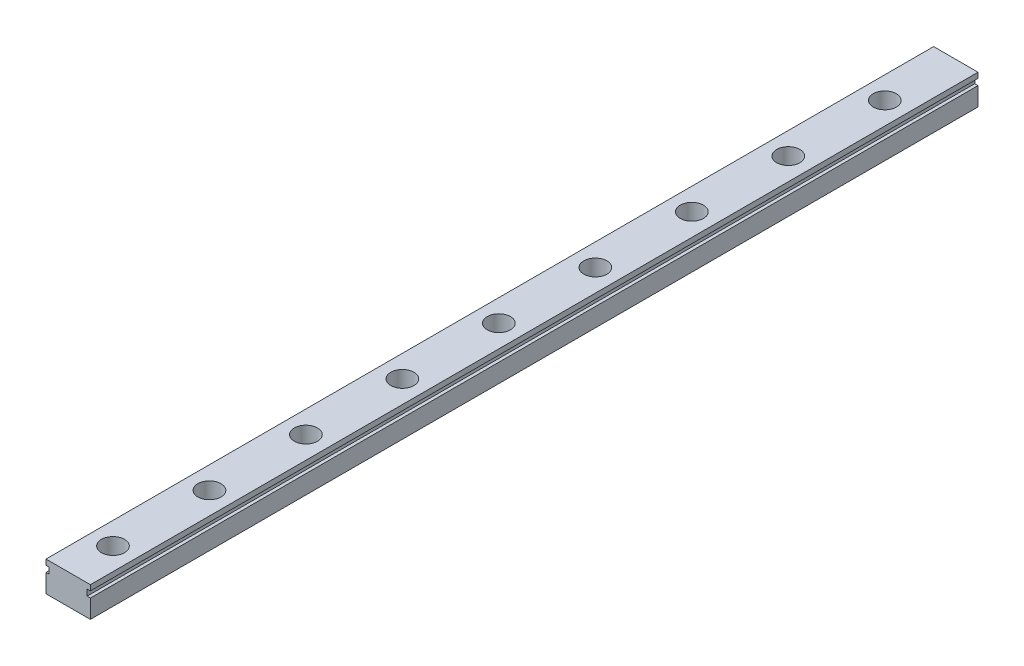
ISO-10303-21;
HEADER;
FILE_DESCRIPTION(('STEP AP214'),'2;1');
FILE_NAME('part.step','',(''),(''),'','','');
FILE_SCHEMA(('AUTOMOTIVE_DESIGN { 1 0 10303 214 1 1 1 1 }'));
ENDSEC;
DATA;
#1=APPLICATION_CONTEXT('core data for automotive mechanical design processes');
#2=APPLICATION_PROTOCOL_DEFINITION('international standard','automotive_design',2000,#1);
#3=PRODUCT_CONTEXT('',#1,'mechanical');
#4=PRODUCT('Part','Part','',(#3));
#5=PRODUCT_RELATED_PRODUCT_CATEGORY('part','',(#4));
#6=PRODUCT_DEFINITION_FORMATION('','',#4);
#7=PRODUCT_DEFINITION_CONTEXT('part definition',#1,'design');
#8=PRODUCT_DEFINITION('design','',#6,#7);
#9=PRODUCT_DEFINITION_SHAPE('','',#8);
#10=(LENGTH_UNIT() NAMED_UNIT(*) SI_UNIT(.MILLI.,.METRE.));
#11=(NAMED_UNIT(*) PLANE_ANGLE_UNIT() SI_UNIT($,.RADIAN.));
#12=(NAMED_UNIT(*) SI_UNIT($,.STERADIAN.) SOLID_ANGLE_UNIT());
#13=UNCERTAINTY_MEASURE_WITH_UNIT(LENGTH_MEASURE(1.E-05),#10,'distance_accuracy_value','');
#14=(GEOMETRIC_REPRESENTATION_CONTEXT(3) GLOBAL_UNCERTAINTY_ASSIGNED_CONTEXT((#13)) GLOBAL_UNIT_ASSIGNED_CONTEXT((#10,
#11,#12)) REPRESENTATION_CONTEXT('',''));
#15=CARTESIAN_POINT('',(0.,0.,0.));
#16=DIRECTION('',(0.,0.,1.));
#17=DIRECTION('',(1.,0.,0.));
#18=AXIS2_PLACEMENT_3D('',#15,#16,#17);
#19=CARTESIAN_POINT('',(5.75,-3.9,230.));
#20=DIRECTION('',(-1.,0.,0.));
#21=DIRECTION('',(0.,0.,1.));
#22=AXIS2_PLACEMENT_3D('',#19,#20,#21);
#23=PLANE('',#22);
#24=DIRECTION('',(0.,1.,0.));
#25=VECTOR('',#24,1.);
#26=CARTESIAN_POINT('',(5.75,-3.9,0.));
#27=LINE('',#26,#25);
#28=CARTESIAN_POINT('',(5.75,-3.9,0.));
#29=VERTEX_POINT('',#28);
#30=CARTESIAN_POINT('',(5.75,0.900000000000001,0.));
#31=VERTEX_POINT('',#30);
#32=EDGE_CURVE('E158',#29,#31,#27,.T.);
#33=ORIENTED_EDGE('',*,*,#32,.T.);
#34=DIRECTION('',(0.,0.,1.));
#35=VECTOR('',#34,1.);
#36=CARTESIAN_POINT('',(5.75,0.900000000000001,0.));
#37=LINE('',#36,#35);
#38=CARTESIAN_POINT('',(5.75,0.900000000000001,230.));
#39=VERTEX_POINT('',#38);
#40=EDGE_CURVE('E159',#31,#39,#37,.T.);
#41=ORIENTED_EDGE('',*,*,#40,.T.);
#42=DIRECTION('',(0.,1.,0.));
#43=VECTOR('',#42,1.);
#44=CARTESIAN_POINT('',(5.75,-3.9,230.));
#45=LINE('',#44,#43);
#46=CARTESIAN_POINT('',(5.75,-3.9,230.));
#47=VERTEX_POINT('',#46);
#48=EDGE_CURVE('E220',#47,#39,#45,.T.);
#49=ORIENTED_EDGE('',*,*,#48,.F.);
#50=DIRECTION('',(0.,0.,-1.));
#51=VECTOR('',#50,1.);
#52=CARTESIAN_POINT('',(5.75,-3.9,230.));
#53=LINE('',#52,#51);
#54=EDGE_CURVE('E181',#47,#29,#53,.T.);
#55=ORIENTED_EDGE('',*,*,#54,.T.);
#56=EDGE_LOOP('',(#33,#41,#49,#55));
#57=FACE_BOUND('',#56,.T.);
#58=ADVANCED_FACE('F43',(#57),#23,.F.);
#59=CARTESIAN_POINT('',(-5.75,-3.9,230.));
#60=DIRECTION('',(1.,0.,0.));
#61=DIRECTION('',(0.,0.,-1.));
#62=AXIS2_PLACEMENT_3D('',#59,#60,#61);
#63=PLANE('',#62);
#64=DIRECTION('',(0.,-1.,0.));
#65=VECTOR('',#64,1.);
#66=CARTESIAN_POINT('',(-5.75,-3.9,0.));
#67=LINE('',#66,#65);
#68=CARTESIAN_POINT('',(-5.75,3.9,0.));
#69=VERTEX_POINT('',#68);
#70=CARTESIAN_POINT('',(-5.75,2.5,0.));
#71=VERTEX_POINT('',#70);
#72=EDGE_CURVE('E174',#69,#71,#67,.T.);
#73=ORIENTED_EDGE('',*,*,#72,.T.);
#74=DIRECTION('',(0.,0.,1.));
#75=VECTOR('',#74,1.);
#76=CARTESIAN_POINT('',(-5.75,2.5,0.));
#77=LINE('',#76,#75);
#78=CARTESIAN_POINT('',(-5.75,2.5,230.));
#79=VERTEX_POINT('',#78);
#80=EDGE_CURVE('E271',#71,#79,#77,.T.);
#81=ORIENTED_EDGE('',*,*,#80,.T.);
#82=DIRECTION('',(0.,-1.,0.));
#83=VECTOR('',#82,1.);
#84=CARTESIAN_POINT('',(-5.75,-3.9,230.));
#85=LINE('',#84,#83);
#86=CARTESIAN_POINT('',(-5.75,3.9,230.));
#87=VERTEX_POINT('',#86);
#88=EDGE_CURVE('E196',#87,#79,#85,.T.);
#89=ORIENTED_EDGE('',*,*,#88,.F.);
#90=DIRECTION('',(0.,0.,-1.));
#91=VECTOR('',#90,1.);
#92=CARTESIAN_POINT('',(-5.75,3.9,230.));
#93=LINE('',#92,#91);
#94=EDGE_CURVE('E52',#87,#69,#93,.T.);
#95=ORIENTED_EDGE('',*,*,#94,.T.);
#96=EDGE_LOOP('',(#73,#81,#89,#95));
#97=FACE_BOUND('',#96,.T.);
#98=ADVANCED_FACE('F193',(#97),#63,.F.);
#99=CARTESIAN_POINT('',(5.75,2.5,230.));
#100=VERTEX_POINT('',#99);
#101=CARTESIAN_POINT('',(5.75,3.9,230.));
#102=VERTEX_POINT('',#101);
#103=EDGE_CURVE('E149',#100,#102,#45,.T.);
#104=ORIENTED_EDGE('',*,*,#103,.F.);
#105=DIRECTION('',(0.,0.,1.));
#106=VECTOR('',#105,1.);
#107=CARTESIAN_POINT('',(5.75,2.5,0.));
#108=LINE('',#107,#106);
#109=CARTESIAN_POINT('',(5.75,2.5,0.));
#110=VERTEX_POINT('',#109);
#111=EDGE_CURVE('E136',#110,#100,#108,.T.);
#112=ORIENTED_EDGE('',*,*,#111,.F.);
#113=CARTESIAN_POINT('',(5.75,3.9,0.));
#114=VERTEX_POINT('',#113);
#115=EDGE_CURVE('E147',#110,#114,#27,.T.);
#116=ORIENTED_EDGE('',*,*,#115,.T.);
#117=DIRECTION('',(0.,0.,-1.));
#118=VECTOR('',#117,1.);
#119=CARTESIAN_POINT('',(5.75,3.9,230.));
#120=LINE('',#119,#118);
#121=EDGE_CURVE('E11',#102,#114,#120,.T.);
#122=ORIENTED_EDGE('',*,*,#121,.F.);
#123=EDGE_LOOP('',(#104,#112,#116,#122));
#124=FACE_BOUND('',#123,.T.);
#125=ADVANCED_FACE('F45',(#124),#23,.F.);
#126=CARTESIAN_POINT('',(-5.75,3.9,230.));
#127=DIRECTION('',(0.,-1.,0.));
#128=DIRECTION('',(0.,0.,-1.));
#129=AXIS2_PLACEMENT_3D('',#126,#127,#128);
#130=PLANE('',#129);
#131=CARTESIAN_POINT('',(0.,3.9,218.4));
#132=DIRECTION('',(0.,1.,0.));
#133=DIRECTION('',(0.,0.,1.));
#134=AXIS2_PLACEMENT_3D('',#131,#132,#133);
#135=CIRCLE('',#134,3.);
#136=CARTESIAN_POINT('',(0.,3.9,221.4));
#137=VERTEX_POINT('',#136);
#138=EDGE_CURVE('E352',#137,#137,#135,.T.);
#139=ORIENTED_EDGE('',*,*,#138,.F.);
#140=EDGE_LOOP('',(#139));
#141=FACE_BOUND('',#140,.T.);
#142=CARTESIAN_POINT('',(0.,3.9,193.4));
#143=DIRECTION('',(0.,1.,0.));
#144=DIRECTION('',(0.,0.,1.));
#145=AXIS2_PLACEMENT_3D('',#142,#143,#144);
#146=CIRCLE('',#145,3.);
#147=CARTESIAN_POINT('',(0.,3.9,196.4));
#148=VERTEX_POINT('',#147);
#149=EDGE_CURVE('E348',#148,#148,#146,.T.);
#150=ORIENTED_EDGE('',*,*,#149,.F.);
#151=EDGE_LOOP('',(#150));
#152=FACE_BOUND('',#151,.T.);
#153=CARTESIAN_POINT('',(0.,3.9,168.4));
#154=DIRECTION('',(0.,1.,0.));
#155=DIRECTION('',(0.,0.,1.));
#156=AXIS2_PLACEMENT_3D('',#153,#154,#155);
#157=CIRCLE('',#156,3.);
#158=CARTESIAN_POINT('',(0.,3.9,171.4));
#159=VERTEX_POINT('',#158);
#160=EDGE_CURVE('E340',#159,#159,#157,.T.);
#161=ORIENTED_EDGE('',*,*,#160,.F.);
#162=EDGE_LOOP('',(#161));
#163=FACE_BOUND('',#162,.T.);
#164=CARTESIAN_POINT('',(0.,3.9,143.4));
#165=DIRECTION('',(0.,1.,0.));
#166=DIRECTION('',(0.,0.,1.));
#167=AXIS2_PLACEMENT_3D('',#164,#165,#166);
#168=CIRCLE('',#167,3.);
#169=CARTESIAN_POINT('',(0.,3.9,146.4));
#170=VERTEX_POINT('',#169);
#171=EDGE_CURVE('E332',#170,#170,#168,.T.);
#172=ORIENTED_EDGE('',*,*,#171,.F.);
#173=EDGE_LOOP('',(#172));
#174=FACE_BOUND('',#173,.T.);
#175=CARTESIAN_POINT('',(0.,3.9,118.4));
#176=DIRECTION('',(0.,1.,0.));
#177=DIRECTION('',(0.,0.,1.));
#178=AXIS2_PLACEMENT_3D('',#175,#176,#177);
#179=CIRCLE('',#178,3.);
#180=CARTESIAN_POINT('',(0.,3.9,121.4));
#181=VERTEX_POINT('',#180);
#182=EDGE_CURVE('E324',#181,#181,#179,.T.);
#183=ORIENTED_EDGE('',*,*,#182,.F.);
#184=EDGE_LOOP('',(#183));
#185=FACE_BOUND('',#184,.T.);
#186=CARTESIAN_POINT('',(0.,3.9,93.4000000000002));
#187=DIRECTION('',(0.,1.,0.));
#188=DIRECTION('',(0.,0.,1.));
#189=AXIS2_PLACEMENT_3D('',#186,#187,#188);
#190=CIRCLE('',#189,3.);
#191=CARTESIAN_POINT('',(0.,3.9,96.4000000000002));
#192=VERTEX_POINT('',#191);
#193=EDGE_CURVE('E316',#192,#192,#190,.T.);
#194=ORIENTED_EDGE('',*,*,#193,.F.);
#195=EDGE_LOOP('',(#194));
#196=FACE_BOUND('',#195,.T.);
#197=CARTESIAN_POINT('',(0.,3.9,68.4000000000002));
#198=DIRECTION('',(0.,1.,0.));
#199=DIRECTION('',(0.,0.,1.));
#200=AXIS2_PLACEMENT_3D('',#197,#198,#199);
#201=CIRCLE('',#200,3.);
#202=CARTESIAN_POINT('',(0.,3.9,71.4000000000002));
#203=VERTEX_POINT('',#202);
#204=EDGE_CURVE('E308',#203,#203,#201,.T.);
#205=ORIENTED_EDGE('',*,*,#204,.F.);
#206=EDGE_LOOP('',(#205));
#207=FACE_BOUND('',#206,.T.);
#208=CARTESIAN_POINT('',(0.,3.9,43.4000000000003));
#209=DIRECTION('',(0.,1.,0.));
#210=DIRECTION('',(0.,0.,1.));
#211=AXIS2_PLACEMENT_3D('',#208,#209,#210);
#212=CIRCLE('',#211,3.);
#213=CARTESIAN_POINT('',(0.,3.9,46.4000000000003));
#214=VERTEX_POINT('',#213);
#215=EDGE_CURVE('E300',#214,#214,#212,.T.);
#216=ORIENTED_EDGE('',*,*,#215,.F.);
#217=EDGE_LOOP('',(#216));
#218=FACE_BOUND('',#217,.T.);
#219=CARTESIAN_POINT('',(0.,3.9,18.4000000000003));
#220=DIRECTION('',(0.,1.,0.));
#221=DIRECTION('',(0.,0.,1.));
#222=AXIS2_PLACEMENT_3D('',#219,#220,#221);
#223=CIRCLE('',#222,3.);
#224=CARTESIAN_POINT('',(0.,3.9,21.4000000000003));
#225=VERTEX_POINT('',#224);
#226=EDGE_CURVE('E291',#225,#225,#223,.T.);
#227=ORIENTED_EDGE('',*,*,#226,.F.);
#228=EDGE_LOOP('',(#227));
#229=FACE_BOUND('',#228,.T.);
#230=DIRECTION('',(-1.,0.,0.));
#231=VECTOR('',#230,1.);
#232=CARTESIAN_POINT('',(-5.75,3.9,0.));
#233=LINE('',#232,#231);
#234=EDGE_CURVE('E156',#114,#69,#233,.T.);
#235=ORIENTED_EDGE('',*,*,#234,.T.);
#236=ORIENTED_EDGE('',*,*,#94,.F.);
#237=DIRECTION('',(-1.,0.,0.));
#238=VECTOR('',#237,1.);
#239=CARTESIAN_POINT('',(-5.75,3.9,230.));
#240=LINE('',#239,#238);
#241=EDGE_CURVE('E224',#102,#87,#240,.T.);
#242=ORIENTED_EDGE('',*,*,#241,.F.);
#243=ORIENTED_EDGE('',*,*,#121,.T.);
#244=EDGE_LOOP('',(#235,#236,#242,#243));
#245=FACE_BOUND('',#244,.T.);
#246=ADVANCED_FACE('F454',(#141,#152,#163,#174,#185,#196,#207,#218,#229,#245),#130,.F.);
#247=CARTESIAN_POINT('',(-5.75,0.900000000000001,230.));
#248=VERTEX_POINT('',#247);
#249=CARTESIAN_POINT('',(-5.75,-3.9,230.));
#250=VERTEX_POINT('',#249);
#251=EDGE_CURVE('E226',#248,#250,#85,.T.);
#252=ORIENTED_EDGE('',*,*,#251,.F.);
#253=DIRECTION('',(0.,0.,1.));
#254=VECTOR('',#253,1.);
#255=CARTESIAN_POINT('',(-5.75,0.900000000000001,0.));
#256=LINE('',#255,#254);
#257=CARTESIAN_POINT('',(-5.75,0.900000000000001,0.));
#258=VERTEX_POINT('',#257);
#259=EDGE_CURVE('E205',#258,#248,#256,.T.);
#260=ORIENTED_EDGE('',*,*,#259,.F.);
#261=CARTESIAN_POINT('',(-5.75,-3.9,0.));
#262=VERTEX_POINT('',#261);
#263=EDGE_CURVE('E173',#258,#262,#67,.T.);
#264=ORIENTED_EDGE('',*,*,#263,.T.);
#265=DIRECTION('',(0.,0.,-1.));
#266=VECTOR('',#265,1.);
#267=CARTESIAN_POINT('',(-5.75,-3.9,230.));
#268=LINE('',#267,#266);
#269=EDGE_CURVE('E185',#250,#262,#268,.T.);
#270=ORIENTED_EDGE('',*,*,#269,.F.);
#271=EDGE_LOOP('',(#252,#260,#264,#270));
#272=FACE_BOUND('',#271,.T.);
#273=ADVANCED_FACE('F242',(#272),#63,.F.);
#274=CARTESIAN_POINT('',(-5.75,-3.9,230.));
#275=DIRECTION('',(0.,1.,0.));
#276=DIRECTION('',(0.,0.,1.));
#277=AXIS2_PLACEMENT_3D('',#274,#275,#276);
#278=PLANE('',#277);
#279=CARTESIAN_POINT('',(0.,-3.9,218.4));
#280=DIRECTION('',(0.,1.,0.));
#281=DIRECTION('',(0.,0.,1.));
#282=AXIS2_PLACEMENT_3D('',#279,#280,#281);
#283=CIRCLE('',#282,1.7);
#284=CARTESIAN_POINT('',(0.,-3.9,220.1));
#285=VERTEX_POINT('',#284);
#286=EDGE_CURVE('E292',#285,#285,#283,.T.);
#287=ORIENTED_EDGE('',*,*,#286,.T.);
#288=EDGE_LOOP('',(#287));
#289=FACE_BOUND('',#288,.T.);
#290=CARTESIAN_POINT('',(0.,-3.9,193.4));
#291=DIRECTION('',(0.,1.,0.));
#292=DIRECTION('',(0.,0.,1.));
#293=AXIS2_PLACEMENT_3D('',#290,#291,#292);
#294=CIRCLE('',#293,1.7);
#295=CARTESIAN_POINT('',(0.,-3.9,195.1));
#296=VERTEX_POINT('',#295);
#297=EDGE_CURVE('E415',#296,#296,#294,.T.);
#298=ORIENTED_EDGE('',*,*,#297,.T.);
#299=EDGE_LOOP('',(#298));
#300=FACE_BOUND('',#299,.T.);
#301=CARTESIAN_POINT('',(0.,-3.9,168.4));
#302=DIRECTION('',(0.,1.,0.));
#303=DIRECTION('',(0.,0.,1.));
#304=AXIS2_PLACEMENT_3D('',#301,#302,#303);
#305=CIRCLE('',#304,1.7);
#306=CARTESIAN_POINT('',(0.,-3.9,170.1));
#307=VERTEX_POINT('',#306);
#308=EDGE_CURVE('E407',#307,#307,#305,.T.);
#309=ORIENTED_EDGE('',*,*,#308,.T.);
#310=EDGE_LOOP('',(#309));
#311=FACE_BOUND('',#310,.T.);
#312=CARTESIAN_POINT('',(0.,-3.9,143.4));
#313=DIRECTION('',(0.,1.,0.));
#314=DIRECTION('',(0.,0.,1.));
#315=AXIS2_PLACEMENT_3D('',#312,#313,#314);
#316=CIRCLE('',#315,1.7);
#317=CARTESIAN_POINT('',(0.,-3.9,145.1));
#318=VERTEX_POINT('',#317);
#319=EDGE_CURVE('E399',#318,#318,#316,.T.);
#320=ORIENTED_EDGE('',*,*,#319,.T.);
#321=EDGE_LOOP('',(#320));
#322=FACE_BOUND('',#321,.T.);
#323=CARTESIAN_POINT('',(0.,-3.9,118.4));
#324=DIRECTION('',(0.,1.,0.));
#325=DIRECTION('',(0.,0.,1.));
#326=AXIS2_PLACEMENT_3D('',#323,#324,#325);
#327=CIRCLE('',#326,1.70000000000001);
#328=CARTESIAN_POINT('',(0.,-3.9,120.1));
#329=VERTEX_POINT('',#328);
#330=EDGE_CURVE('E391',#329,#329,#327,.T.);
#331=ORIENTED_EDGE('',*,*,#330,.T.);
#332=EDGE_LOOP('',(#331));
#333=FACE_BOUND('',#332,.T.);
#334=CARTESIAN_POINT('',(0.,-3.9,93.4000000000002));
#335=DIRECTION('',(0.,1.,0.));
#336=DIRECTION('',(0.,0.,1.));
#337=AXIS2_PLACEMENT_3D('',#334,#335,#336);
#338=CIRCLE('',#337,1.70000000000001);
#339=CARTESIAN_POINT('',(0.,-3.9,95.1000000000002));
#340=VERTEX_POINT('',#339);
#341=EDGE_CURVE('E383',#340,#340,#338,.T.);
#342=ORIENTED_EDGE('',*,*,#341,.T.);
#343=EDGE_LOOP('',(#342));
#344=FACE_BOUND('',#343,.T.);
#345=CARTESIAN_POINT('',(0.,-3.9,68.4000000000002));
#346=DIRECTION('',(0.,1.,0.));
#347=DIRECTION('',(0.,0.,1.));
#348=AXIS2_PLACEMENT_3D('',#345,#346,#347);
#349=CIRCLE('',#348,1.70000000000001);
#350=CARTESIAN_POINT('',(0.,-3.9,70.1000000000003));
#351=VERTEX_POINT('',#350);
#352=EDGE_CURVE('E375',#351,#351,#349,.T.);
#353=ORIENTED_EDGE('',*,*,#352,.T.);
#354=EDGE_LOOP('',(#353));
#355=FACE_BOUND('',#354,.T.);
#356=CARTESIAN_POINT('',(0.,-3.9,43.4000000000003));
#357=DIRECTION('',(0.,1.,0.));
#358=DIRECTION('',(0.,0.,1.));
#359=AXIS2_PLACEMENT_3D('',#356,#357,#358);
#360=CIRCLE('',#359,1.70000000000001);
#361=CARTESIAN_POINT('',(0.,-3.9,45.1000000000003));
#362=VERTEX_POINT('',#361);
#363=EDGE_CURVE('E367',#362,#362,#360,.T.);
#364=ORIENTED_EDGE('',*,*,#363,.T.);
#365=EDGE_LOOP('',(#364));
#366=FACE_BOUND('',#365,.T.);
#367=CARTESIAN_POINT('',(0.,-3.9,18.4000000000003));
#368=DIRECTION('',(0.,1.,0.));
#369=DIRECTION('',(0.,0.,1.));
#370=AXIS2_PLACEMENT_3D('',#367,#368,#369);
#371=CIRCLE('',#370,1.70000000000001);
#372=CARTESIAN_POINT('',(0.,-3.9,20.1000000000003));
#373=VERTEX_POINT('',#372);
#374=EDGE_CURVE('E359',#373,#373,#371,.T.);
#375=ORIENTED_EDGE('',*,*,#374,.T.);
#376=EDGE_LOOP('',(#375));
#377=FACE_BOUND('',#376,.T.);
#378=DIRECTION('',(1.,0.,0.));
#379=VECTOR('',#378,1.);
#380=CARTESIAN_POINT('',(-5.75,-3.9,0.));
#381=LINE('',#380,#379);
#382=EDGE_CURVE('E178',#262,#29,#381,.T.);
#383=ORIENTED_EDGE('',*,*,#382,.T.);
#384=ORIENTED_EDGE('',*,*,#54,.F.);
#385=DIRECTION('',(1.,0.,0.));
#386=VECTOR('',#385,1.);
#387=CARTESIAN_POINT('',(-5.75,-3.9,230.));
#388=LINE('',#387,#386);
#389=EDGE_CURVE('E169',#250,#47,#388,.T.);
#390=ORIENTED_EDGE('',*,*,#389,.F.);
#391=ORIENTED_EDGE('',*,*,#269,.T.);
#392=EDGE_LOOP('',(#383,#384,#390,#391));
#393=FACE_BOUND('',#392,.T.);
#394=ADVANCED_FACE('F246',(#289,#300,#311,#322,#333,#344,#355,#366,#377,#393),#278,.F.);
#395=CARTESIAN_POINT('',(0.,0.,230.));
#396=DIRECTION('',(0.,0.,-1.));
#397=DIRECTION('',(-1.,0.,0.));
#398=AXIS2_PLACEMENT_3D('',#395,#396,#397);
#399=PLANE('',#398);
#400=ORIENTED_EDGE('',*,*,#48,.T.);
#401=DIRECTION('',(1.,0.,0.));
#402=VECTOR('',#401,1.);
#403=CARTESIAN_POINT('',(5.75,0.900000000000001,230.));
#404=LINE('',#403,#402);
#405=CARTESIAN_POINT('',(4.91474977144023,0.900000000000001,230.));
#406=VERTEX_POINT('',#405);
#407=EDGE_CURVE('E142',#406,#39,#404,.T.);
#408=ORIENTED_EDGE('',*,*,#407,.F.);
#409=DIRECTION('',(0.,-1.,0.));
#410=VECTOR('',#409,1.);
#411=CARTESIAN_POINT('',(4.91474977144023,2.5,230.));
#412=LINE('',#411,#410);
#413=CARTESIAN_POINT('',(4.91474977144023,2.5,230.));
#414=VERTEX_POINT('',#413);
#415=EDGE_CURVE('E253',#414,#406,#412,.T.);
#416=ORIENTED_EDGE('',*,*,#415,.F.);
#417=DIRECTION('',(-1.,0.,0.));
#418=VECTOR('',#417,1.);
#419=CARTESIAN_POINT('',(5.75,2.5,230.));
#420=LINE('',#419,#418);
#421=EDGE_CURVE('E258',#100,#414,#420,.T.);
#422=ORIENTED_EDGE('',*,*,#421,.F.);
#423=ORIENTED_EDGE('',*,*,#103,.T.);
#424=ORIENTED_EDGE('',*,*,#241,.T.);
#425=ORIENTED_EDGE('',*,*,#88,.T.);
#426=DIRECTION('',(-1.,0.,0.));
#427=VECTOR('',#426,1.);
#428=CARTESIAN_POINT('',(-5.75,2.5,230.));
#429=LINE('',#428,#427);
#430=CARTESIAN_POINT('',(-4.91474977144023,2.5,230.));
#431=VERTEX_POINT('',#430);
#432=EDGE_CURVE('E219',#431,#79,#429,.T.);
#433=ORIENTED_EDGE('',*,*,#432,.F.);
#434=DIRECTION('',(0.,1.,0.));
#435=VECTOR('',#434,1.);
#436=CARTESIAN_POINT('',(-4.91474977144023,2.5,230.));
#437=LINE('',#436,#435);
#438=CARTESIAN_POINT('',(-4.91474977144023,0.900000000000001,230.));
#439=VERTEX_POINT('',#438);
#440=EDGE_CURVE('E276',#439,#431,#437,.T.);
#441=ORIENTED_EDGE('',*,*,#440,.F.);
#442=DIRECTION('',(1.,0.,0.));
#443=VECTOR('',#442,1.);
#444=CARTESIAN_POINT('',(-5.75,0.900000000000001,230.));
#445=LINE('',#444,#443);
#446=EDGE_CURVE('E214',#248,#439,#445,.T.);
#447=ORIENTED_EDGE('',*,*,#446,.F.);
#448=ORIENTED_EDGE('',*,*,#251,.T.);
#449=ORIENTED_EDGE('',*,*,#389,.T.);
#450=EDGE_LOOP('',(#400,#408,#416,#422,#423,#424,#425,#433,#441,#447,#448,#449));
#451=FACE_BOUND('',#450,.T.);
#452=ADVANCED_FACE('F235',(#451),#399,.F.);
#453=CARTESIAN_POINT('',(0.,0.,0.));
#454=DIRECTION('',(0.,0.,-1.));
#455=DIRECTION('',(-1.,0.,0.));
#456=AXIS2_PLACEMENT_3D('',#453,#454,#455);
#457=PLANE('',#456);
#458=DIRECTION('',(1.,0.,0.));
#459=VECTOR('',#458,1.);
#460=CARTESIAN_POINT('',(5.75,0.900000000000001,0.));
#461=LINE('',#460,#459);
#462=CARTESIAN_POINT('',(4.91474977144023,0.900000000000001,0.));
#463=VERTEX_POINT('',#462);
#464=EDGE_CURVE('E151',#463,#31,#461,.T.);
#465=ORIENTED_EDGE('',*,*,#464,.T.);
#466=ORIENTED_EDGE('',*,*,#32,.F.);
#467=ORIENTED_EDGE('',*,*,#382,.F.);
#468=ORIENTED_EDGE('',*,*,#263,.F.);
#469=DIRECTION('',(1.,0.,0.));
#470=VECTOR('',#469,1.);
#471=CARTESIAN_POINT('',(-5.75,0.900000000000001,0.));
#472=LINE('',#471,#470);
#473=CARTESIAN_POINT('',(-4.91474977144023,0.900000000000001,0.));
#474=VERTEX_POINT('',#473);
#475=EDGE_CURVE('E209',#258,#474,#472,.T.);
#476=ORIENTED_EDGE('',*,*,#475,.T.);
#477=DIRECTION('',(0.,1.,0.));
#478=VECTOR('',#477,1.);
#479=CARTESIAN_POINT('',(-4.91474977144023,2.5,0.));
#480=LINE('',#479,#478);
#481=CARTESIAN_POINT('',(-4.91474977144023,2.5,0.));
#482=VERTEX_POINT('',#481);
#483=EDGE_CURVE('E67',#474,#482,#480,.T.);
#484=ORIENTED_EDGE('',*,*,#483,.T.);
#485=DIRECTION('',(-1.,0.,0.));
#486=VECTOR('',#485,1.);
#487=CARTESIAN_POINT('',(-5.75,2.5,0.));
#488=LINE('',#487,#486);
#489=EDGE_CURVE('E201',#482,#71,#488,.T.);
#490=ORIENTED_EDGE('',*,*,#489,.T.);
#491=ORIENTED_EDGE('',*,*,#72,.F.);
#492=ORIENTED_EDGE('',*,*,#234,.F.);
#493=ORIENTED_EDGE('',*,*,#115,.F.);
#494=DIRECTION('',(-1.,0.,0.));
#495=VECTOR('',#494,1.);
#496=CARTESIAN_POINT('',(5.75,2.5,0.));
#497=LINE('',#496,#495);
#498=CARTESIAN_POINT('',(4.91474977144023,2.5,0.));
#499=VERTEX_POINT('',#498);
#500=EDGE_CURVE('E132',#110,#499,#497,.T.);
#501=ORIENTED_EDGE('',*,*,#500,.T.);
#502=DIRECTION('',(0.,-1.,0.));
#503=VECTOR('',#502,1.);
#504=CARTESIAN_POINT('',(4.91474977144023,2.5,0.));
#505=LINE('',#504,#503);
#506=EDGE_CURVE('E59',#499,#463,#505,.T.);
#507=ORIENTED_EDGE('',*,*,#506,.T.);
#508=EDGE_LOOP('',(#465,#466,#467,#468,#476,#484,#490,#491,#492,#493,#501,#507));
#509=FACE_BOUND('',#508,.T.);
#510=ADVANCED_FACE('F154',(#509),#457,.T.);
#511=CARTESIAN_POINT('',(-5.75,2.5,0.));
#512=DIRECTION('',(0.,1.,0.));
#513=DIRECTION('',(0.,0.,1.));
#514=AXIS2_PLACEMENT_3D('',#511,#512,#513);
#515=PLANE('',#514);
#516=ORIENTED_EDGE('',*,*,#432,.T.);
#517=ORIENTED_EDGE('',*,*,#80,.F.);
#518=ORIENTED_EDGE('',*,*,#489,.F.);
#519=DIRECTION('',(0.,0.,1.));
#520=VECTOR('',#519,1.);
#521=CARTESIAN_POINT('',(-4.91474977144023,2.5,0.));
#522=LINE('',#521,#520);
#523=EDGE_CURVE('E268',#482,#431,#522,.T.);
#524=ORIENTED_EDGE('',*,*,#523,.T.);
#525=EDGE_LOOP('',(#516,#517,#518,#524));
#526=FACE_BOUND('',#525,.T.);
#527=ADVANCED_FACE('F531',(#526),#515,.F.);
#528=CARTESIAN_POINT('',(-4.91474977144023,2.5,0.));
#529=DIRECTION('',(1.,0.,0.));
#530=DIRECTION('',(0.,0.,-1.));
#531=AXIS2_PLACEMENT_3D('',#528,#529,#530);
#532=PLANE('',#531);
#533=ORIENTED_EDGE('',*,*,#440,.T.);
#534=ORIENTED_EDGE('',*,*,#523,.F.);
#535=ORIENTED_EDGE('',*,*,#483,.F.);
#536=DIRECTION('',(0.,0.,1.));
#537=VECTOR('',#536,1.);
#538=CARTESIAN_POINT('',(-4.91474977144023,0.900000000000001,0.));
#539=LINE('',#538,#537);
#540=EDGE_CURVE('E211',#474,#439,#539,.T.);
#541=ORIENTED_EDGE('',*,*,#540,.T.);
#542=EDGE_LOOP('',(#533,#534,#535,#541));
#543=FACE_BOUND('',#542,.T.);
#544=ADVANCED_FACE('F538',(#543),#532,.F.);
#545=CARTESIAN_POINT('',(-5.75,0.900000000000001,0.));
#546=DIRECTION('',(0.,-1.,0.));
#547=DIRECTION('',(0.,0.,-1.));
#548=AXIS2_PLACEMENT_3D('',#545,#546,#547);
#549=PLANE('',#548);
#550=ORIENTED_EDGE('',*,*,#446,.T.);
#551=ORIENTED_EDGE('',*,*,#540,.F.);
#552=ORIENTED_EDGE('',*,*,#475,.F.);
#553=ORIENTED_EDGE('',*,*,#259,.T.);
#554=EDGE_LOOP('',(#550,#551,#552,#553));
#555=FACE_BOUND('',#554,.T.);
#556=ADVANCED_FACE('F545',(#555),#549,.F.);
#557=CARTESIAN_POINT('',(5.75,0.900000000000001,0.));
#558=DIRECTION('',(0.,-1.,0.));
#559=DIRECTION('',(0.,0.,-1.));
#560=AXIS2_PLACEMENT_3D('',#557,#558,#559);
#561=PLANE('',#560);
#562=ORIENTED_EDGE('',*,*,#407,.T.);
#563=ORIENTED_EDGE('',*,*,#40,.F.);
#564=ORIENTED_EDGE('',*,*,#464,.F.);
#565=DIRECTION('',(0.,0.,1.));
#566=VECTOR('',#565,1.);
#567=CARTESIAN_POINT('',(4.91474977144023,0.900000000000001,0.));
#568=LINE('',#567,#566);
#569=EDGE_CURVE('E165',#463,#406,#568,.T.);
#570=ORIENTED_EDGE('',*,*,#569,.T.);
#571=EDGE_LOOP('',(#562,#563,#564,#570));
#572=FACE_BOUND('',#571,.T.);
#573=ADVANCED_FACE('F552',(#572),#561,.F.);
#574=CARTESIAN_POINT('',(4.91474977144023,2.5,0.));
#575=DIRECTION('',(-1.,0.,0.));
#576=DIRECTION('',(0.,0.,1.));
#577=AXIS2_PLACEMENT_3D('',#574,#575,#576);
#578=PLANE('',#577);
#579=ORIENTED_EDGE('',*,*,#415,.T.);
#580=ORIENTED_EDGE('',*,*,#569,.F.);
#581=ORIENTED_EDGE('',*,*,#506,.F.);
#582=DIRECTION('',(0.,0.,1.));
#583=VECTOR('',#582,1.);
#584=CARTESIAN_POINT('',(4.91474977144023,2.5,0.));
#585=LINE('',#584,#583);
#586=EDGE_CURVE('E138',#499,#414,#585,.T.);
#587=ORIENTED_EDGE('',*,*,#586,.T.);
#588=EDGE_LOOP('',(#579,#580,#581,#587));
#589=FACE_BOUND('',#588,.T.);
#590=ADVANCED_FACE('F487',(#589),#578,.F.);
#591=CARTESIAN_POINT('',(5.75,2.5,0.));
#592=DIRECTION('',(0.,1.,0.));
#593=DIRECTION('',(0.,0.,1.));
#594=AXIS2_PLACEMENT_3D('',#591,#592,#593);
#595=PLANE('',#594);
#596=ORIENTED_EDGE('',*,*,#421,.T.);
#597=ORIENTED_EDGE('',*,*,#586,.F.);
#598=ORIENTED_EDGE('',*,*,#500,.F.);
#599=ORIENTED_EDGE('',*,*,#111,.T.);
#600=EDGE_LOOP('',(#596,#597,#598,#599));
#601=FACE_BOUND('',#600,.T.);
#602=ADVANCED_FACE('F135',(#601),#595,.F.);
#603=CARTESIAN_POINT('',(0.,-0.799999999999999,18.4000000000003));
#604=DIRECTION('',(0.,1.,0.));
#605=DIRECTION('',(0.,0.,1.));
#606=AXIS2_PLACEMENT_3D('',#603,#604,#605);
#607=CYLINDRICAL_SURFACE('',#606,3.);
#608=CARTESIAN_POINT('',(0.,-0.799999999999999,18.4000000000003));
#609=DIRECTION('',(0.,1.,0.));
#610=DIRECTION('',(0.,0.,1.));
#611=AXIS2_PLACEMENT_3D('',#608,#609,#610);
#612=CIRCLE('',#611,3.);
#613=CARTESIAN_POINT('',(0.,-0.799999999999999,21.4000000000003));
#614=VERTEX_POINT('',#613);
#615=EDGE_CURVE('E287',#614,#614,#612,.T.);
#616=ORIENTED_EDGE('',*,*,#615,.F.);
#617=EDGE_LOOP('',(#616));
#618=FACE_BOUND('',#617,.T.);
#619=ORIENTED_EDGE('',*,*,#226,.T.);
#620=EDGE_LOOP('',(#619));
#621=FACE_BOUND('',#620,.T.);
#622=ADVANCED_FACE('F475',(#618,#621),#607,.F.);
#623=CARTESIAN_POINT('',(0.,-0.799999999999999,18.4000000000003));
#624=DIRECTION('',(0.,1.,0.));
#625=DIRECTION('',(0.,0.,1.));
#626=AXIS2_PLACEMENT_3D('',#623,#624,#625);
#627=PLANE('',#626);
#628=CARTESIAN_POINT('',(0.,-0.799999999999999,18.4000000000003));
#629=DIRECTION('',(0.,1.,0.));
#630=DIRECTION('',(0.,0.,1.));
#631=AXIS2_PLACEMENT_3D('',#628,#629,#630);
#632=CIRCLE('',#631,1.70000000000001);
#633=CARTESIAN_POINT('',(0.,-0.799999999999999,20.1000000000003));
#634=VERTEX_POINT('',#633);
#635=EDGE_CURVE('E363',#634,#634,#632,.T.);
#636=ORIENTED_EDGE('',*,*,#635,.F.);
#637=EDGE_LOOP('',(#636));
#638=FACE_BOUND('',#637,.T.);
#639=ORIENTED_EDGE('',*,*,#615,.T.);
#640=EDGE_LOOP('',(#639));
#641=FACE_BOUND('',#640,.T.);
#642=ADVANCED_FACE('F477',(#638,#641),#627,.T.);
#643=CARTESIAN_POINT('',(0.,-0.799999999999999,43.4000000000003));
#644=DIRECTION('',(0.,1.,0.));
#645=DIRECTION('',(0.,0.,1.));
#646=AXIS2_PLACEMENT_3D('',#643,#644,#645);
#647=CYLINDRICAL_SURFACE('',#646,3.);
#648=CARTESIAN_POINT('',(0.,-0.799999999999999,43.4000000000003));
#649=DIRECTION('',(0.,1.,0.));
#650=DIRECTION('',(0.,0.,1.));
#651=AXIS2_PLACEMENT_3D('',#648,#649,#650);
#652=CIRCLE('',#651,3.);
#653=CARTESIAN_POINT('',(0.,-0.799999999999999,46.4000000000003));
#654=VERTEX_POINT('',#653);
#655=EDGE_CURVE('E296',#654,#654,#652,.T.);
#656=ORIENTED_EDGE('',*,*,#655,.F.);
#657=EDGE_LOOP('',(#656));
#658=FACE_BOUND('',#657,.T.);
#659=ORIENTED_EDGE('',*,*,#215,.T.);
#660=EDGE_LOOP('',(#659));
#661=FACE_BOUND('',#660,.T.);
#662=ADVANCED_FACE('F484',(#658,#661),#647,.F.);
#663=CARTESIAN_POINT('',(0.,-0.799999999999999,43.4000000000003));
#664=DIRECTION('',(0.,1.,0.));
#665=DIRECTION('',(0.,0.,1.));
#666=AXIS2_PLACEMENT_3D('',#663,#664,#665);
#667=PLANE('',#666);
#668=CARTESIAN_POINT('',(0.,-0.799999999999999,43.4000000000003));
#669=DIRECTION('',(0.,1.,0.));
#670=DIRECTION('',(0.,0.,1.));
#671=AXIS2_PLACEMENT_3D('',#668,#669,#670);
#672=CIRCLE('',#671,1.70000000000001);
#673=CARTESIAN_POINT('',(0.,-0.799999999999999,45.1000000000003));
#674=VERTEX_POINT('',#673);
#675=EDGE_CURVE('E371',#674,#674,#672,.T.);
#676=ORIENTED_EDGE('',*,*,#675,.F.);
#677=EDGE_LOOP('',(#676));
#678=FACE_BOUND('',#677,.T.);
#679=ORIENTED_EDGE('',*,*,#655,.T.);
#680=EDGE_LOOP('',(#679));
#681=FACE_BOUND('',#680,.T.);
#682=ADVANCED_FACE('F597',(#678,#681),#667,.T.);
#683=CARTESIAN_POINT('',(0.,-0.799999999999999,68.4000000000002));
#684=DIRECTION('',(0.,1.,0.));
#685=DIRECTION('',(0.,0.,1.));
#686=AXIS2_PLACEMENT_3D('',#683,#684,#685);
#687=CYLINDRICAL_SURFACE('',#686,3.);
#688=CARTESIAN_POINT('',(0.,-0.799999999999999,68.4000000000002));
#689=DIRECTION('',(0.,1.,0.));
#690=DIRECTION('',(0.,0.,1.));
#691=AXIS2_PLACEMENT_3D('',#688,#689,#690);
#692=CIRCLE('',#691,3.);
#693=CARTESIAN_POINT('',(0.,-0.799999999999999,71.4000000000002));
#694=VERTEX_POINT('',#693);
#695=EDGE_CURVE('E304',#694,#694,#692,.T.);
#696=ORIENTED_EDGE('',*,*,#695,.F.);
#697=EDGE_LOOP('',(#696));
#698=FACE_BOUND('',#697,.T.);
#699=ORIENTED_EDGE('',*,*,#204,.T.);
#700=EDGE_LOOP('',(#699));
#701=FACE_BOUND('',#700,.T.);
#702=ADVANCED_FACE('F608',(#698,#701),#687,.F.);
#703=CARTESIAN_POINT('',(0.,-0.799999999999999,68.4000000000002));
#704=DIRECTION('',(0.,1.,0.));
#705=DIRECTION('',(0.,0.,1.));
#706=AXIS2_PLACEMENT_3D('',#703,#704,#705);
#707=PLANE('',#706);
#708=CARTESIAN_POINT('',(0.,-0.799999999999999,68.4000000000002));
#709=DIRECTION('',(0.,1.,0.));
#710=DIRECTION('',(0.,0.,1.));
#711=AXIS2_PLACEMENT_3D('',#708,#709,#710);
#712=CIRCLE('',#711,1.70000000000001);
#713=CARTESIAN_POINT('',(0.,-0.799999999999999,70.1000000000003));
#714=VERTEX_POINT('',#713);
#715=EDGE_CURVE('E379',#714,#714,#712,.T.);
#716=ORIENTED_EDGE('',*,*,#715,.F.);
#717=EDGE_LOOP('',(#716));
#718=FACE_BOUND('',#717,.T.);
#719=ORIENTED_EDGE('',*,*,#695,.T.);
#720=EDGE_LOOP('',(#719));
#721=FACE_BOUND('',#720,.T.);
#722=ADVANCED_FACE('F618',(#718,#721),#707,.T.);
#723=CARTESIAN_POINT('',(0.,-0.799999999999999,93.4000000000002));
#724=DIRECTION('',(0.,1.,0.));
#725=DIRECTION('',(0.,0.,1.));
#726=AXIS2_PLACEMENT_3D('',#723,#724,#725);
#727=CYLINDRICAL_SURFACE('',#726,3.);
#728=CARTESIAN_POINT('',(0.,-0.799999999999999,93.4000000000002));
#729=DIRECTION('',(0.,1.,0.));
#730=DIRECTION('',(0.,0.,1.));
#731=AXIS2_PLACEMENT_3D('',#728,#729,#730);
#732=CIRCLE('',#731,3.);
#733=CARTESIAN_POINT('',(0.,-0.799999999999999,96.4000000000002));
#734=VERTEX_POINT('',#733);
#735=EDGE_CURVE('E312',#734,#734,#732,.T.);
#736=ORIENTED_EDGE('',*,*,#735,.F.);
#737=EDGE_LOOP('',(#736));
#738=FACE_BOUND('',#737,.T.);
#739=ORIENTED_EDGE('',*,*,#193,.T.);
#740=EDGE_LOOP('',(#739));
#741=FACE_BOUND('',#740,.T.);
#742=ADVANCED_FACE('F629',(#738,#741),#727,.F.);
#743=CARTESIAN_POINT('',(0.,-0.799999999999999,93.4000000000002));
#744=DIRECTION('',(0.,1.,0.));
#745=DIRECTION('',(0.,0.,1.));
#746=AXIS2_PLACEMENT_3D('',#743,#744,#745);
#747=PLANE('',#746);
#748=CARTESIAN_POINT('',(0.,-0.799999999999999,93.4000000000002));
#749=DIRECTION('',(0.,1.,0.));
#750=DIRECTION('',(0.,0.,1.));
#751=AXIS2_PLACEMENT_3D('',#748,#749,#750);
#752=CIRCLE('',#751,1.70000000000001);
#753=CARTESIAN_POINT('',(0.,-0.799999999999999,95.1000000000002));
#754=VERTEX_POINT('',#753);
#755=EDGE_CURVE('E387',#754,#754,#752,.T.);
#756=ORIENTED_EDGE('',*,*,#755,.F.);
#757=EDGE_LOOP('',(#756));
#758=FACE_BOUND('',#757,.T.);
#759=ORIENTED_EDGE('',*,*,#735,.T.);
#760=EDGE_LOOP('',(#759));
#761=FACE_BOUND('',#760,.T.);
#762=ADVANCED_FACE('F640',(#758,#761),#747,.T.);
#763=CARTESIAN_POINT('',(0.,-0.799999999999999,118.4));
#764=DIRECTION('',(0.,1.,0.));
#765=DIRECTION('',(0.,0.,1.));
#766=AXIS2_PLACEMENT_3D('',#763,#764,#765);
#767=CYLINDRICAL_SURFACE('',#766,3.);
#768=CARTESIAN_POINT('',(0.,-0.799999999999999,118.4));
#769=DIRECTION('',(0.,1.,0.));
#770=DIRECTION('',(0.,0.,1.));
#771=AXIS2_PLACEMENT_3D('',#768,#769,#770);
#772=CIRCLE('',#771,3.);
#773=CARTESIAN_POINT('',(0.,-0.799999999999999,121.4));
#774=VERTEX_POINT('',#773);
#775=EDGE_CURVE('E320',#774,#774,#772,.T.);
#776=ORIENTED_EDGE('',*,*,#775,.F.);
#777=EDGE_LOOP('',(#776));
#778=FACE_BOUND('',#777,.T.);
#779=ORIENTED_EDGE('',*,*,#182,.T.);
#780=EDGE_LOOP('',(#779));
#781=FACE_BOUND('',#780,.T.);
#782=ADVANCED_FACE('F651',(#778,#781),#767,.F.);
#783=CARTESIAN_POINT('',(0.,-0.799999999999999,118.4));
#784=DIRECTION('',(0.,1.,0.));
#785=DIRECTION('',(0.,0.,1.));
#786=AXIS2_PLACEMENT_3D('',#783,#784,#785);
#787=PLANE('',#786);
#788=CARTESIAN_POINT('',(0.,-0.799999999999999,118.4));
#789=DIRECTION('',(0.,1.,0.));
#790=DIRECTION('',(0.,0.,1.));
#791=AXIS2_PLACEMENT_3D('',#788,#789,#790);
#792=CIRCLE('',#791,1.70000000000001);
#793=CARTESIAN_POINT('',(0.,-0.799999999999999,120.1));
#794=VERTEX_POINT('',#793);
#795=EDGE_CURVE('E395',#794,#794,#792,.T.);
#796=ORIENTED_EDGE('',*,*,#795,.F.);
#797=EDGE_LOOP('',(#796));
#798=FACE_BOUND('',#797,.T.);
#799=ORIENTED_EDGE('',*,*,#775,.T.);
#800=EDGE_LOOP('',(#799));
#801=FACE_BOUND('',#800,.T.);
#802=ADVANCED_FACE('F662',(#798,#801),#787,.T.);
#803=CARTESIAN_POINT('',(0.,-0.799999999999999,143.4));
#804=DIRECTION('',(0.,1.,0.));
#805=DIRECTION('',(0.,0.,1.));
#806=AXIS2_PLACEMENT_3D('',#803,#804,#805);
#807=CYLINDRICAL_SURFACE('',#806,3.);
#808=CARTESIAN_POINT('',(0.,-0.799999999999999,143.4));
#809=DIRECTION('',(0.,1.,0.));
#810=DIRECTION('',(0.,0.,1.));
#811=AXIS2_PLACEMENT_3D('',#808,#809,#810);
#812=CIRCLE('',#811,3.);
#813=CARTESIAN_POINT('',(0.,-0.799999999999999,146.4));
#814=VERTEX_POINT('',#813);
#815=EDGE_CURVE('E328',#814,#814,#812,.T.);
#816=ORIENTED_EDGE('',*,*,#815,.F.);
#817=EDGE_LOOP('',(#816));
#818=FACE_BOUND('',#817,.T.);
#819=ORIENTED_EDGE('',*,*,#171,.T.);
#820=EDGE_LOOP('',(#819));
#821=FACE_BOUND('',#820,.T.);
#822=ADVANCED_FACE('F673',(#818,#821),#807,.F.);
#823=CARTESIAN_POINT('',(0.,-0.799999999999999,143.4));
#824=DIRECTION('',(0.,1.,0.));
#825=DIRECTION('',(0.,0.,1.));
#826=AXIS2_PLACEMENT_3D('',#823,#824,#825);
#827=PLANE('',#826);
#828=CARTESIAN_POINT('',(0.,-0.799999999999999,143.4));
#829=DIRECTION('',(0.,1.,0.));
#830=DIRECTION('',(0.,0.,1.));
#831=AXIS2_PLACEMENT_3D('',#828,#829,#830);
#832=CIRCLE('',#831,1.7);
#833=CARTESIAN_POINT('',(0.,-0.799999999999999,145.1));
#834=VERTEX_POINT('',#833);
#835=EDGE_CURVE('E403',#834,#834,#832,.T.);
#836=ORIENTED_EDGE('',*,*,#835,.F.);
#837=EDGE_LOOP('',(#836));
#838=FACE_BOUND('',#837,.T.);
#839=ORIENTED_EDGE('',*,*,#815,.T.);
#840=EDGE_LOOP('',(#839));
#841=FACE_BOUND('',#840,.T.);
#842=ADVANCED_FACE('F684',(#838,#841),#827,.T.);
#843=CARTESIAN_POINT('',(0.,-0.799999999999999,168.4));
#844=DIRECTION('',(0.,1.,0.));
#845=DIRECTION('',(0.,0.,1.));
#846=AXIS2_PLACEMENT_3D('',#843,#844,#845);
#847=CYLINDRICAL_SURFACE('',#846,3.);
#848=CARTESIAN_POINT('',(0.,-0.799999999999999,168.4));
#849=DIRECTION('',(0.,1.,0.));
#850=DIRECTION('',(0.,0.,1.));
#851=AXIS2_PLACEMENT_3D('',#848,#849,#850);
#852=CIRCLE('',#851,3.);
#853=CARTESIAN_POINT('',(0.,-0.799999999999999,171.4));
#854=VERTEX_POINT('',#853);
#855=EDGE_CURVE('E336',#854,#854,#852,.T.);
#856=ORIENTED_EDGE('',*,*,#855,.F.);
#857=EDGE_LOOP('',(#856));
#858=FACE_BOUND('',#857,.T.);
#859=ORIENTED_EDGE('',*,*,#160,.T.);
#860=EDGE_LOOP('',(#859));
#861=FACE_BOUND('',#860,.T.);
#862=ADVANCED_FACE('F695',(#858,#861),#847,.F.);
#863=CARTESIAN_POINT('',(0.,-0.799999999999999,168.4));
#864=DIRECTION('',(0.,1.,0.));
#865=DIRECTION('',(0.,0.,1.));
#866=AXIS2_PLACEMENT_3D('',#863,#864,#865);
#867=PLANE('',#866);
#868=CARTESIAN_POINT('',(0.,-0.799999999999999,168.4));
#869=DIRECTION('',(0.,1.,0.));
#870=DIRECTION('',(0.,0.,1.));
#871=AXIS2_PLACEMENT_3D('',#868,#869,#870);
#872=CIRCLE('',#871,1.7);
#873=CARTESIAN_POINT('',(0.,-0.799999999999999,170.1));
#874=VERTEX_POINT('',#873);
#875=EDGE_CURVE('E411',#874,#874,#872,.T.);
#876=ORIENTED_EDGE('',*,*,#875,.F.);
#877=EDGE_LOOP('',(#876));
#878=FACE_BOUND('',#877,.T.);
#879=ORIENTED_EDGE('',*,*,#855,.T.);
#880=EDGE_LOOP('',(#879));
#881=FACE_BOUND('',#880,.T.);
#882=ADVANCED_FACE('F706',(#878,#881),#867,.T.);
#883=CARTESIAN_POINT('',(0.,-0.799999999999999,193.4));
#884=DIRECTION('',(0.,1.,0.));
#885=DIRECTION('',(0.,0.,1.));
#886=AXIS2_PLACEMENT_3D('',#883,#884,#885);
#887=CYLINDRICAL_SURFACE('',#886,3.);
#888=CARTESIAN_POINT('',(0.,-0.799999999999999,193.4));
#889=DIRECTION('',(0.,1.,0.));
#890=DIRECTION('',(0.,0.,1.));
#891=AXIS2_PLACEMENT_3D('',#888,#889,#890);
#892=CIRCLE('',#891,3.);
#893=CARTESIAN_POINT('',(0.,-0.799999999999999,196.4));
#894=VERTEX_POINT('',#893);
#895=EDGE_CURVE('E344',#894,#894,#892,.T.);
#896=ORIENTED_EDGE('',*,*,#895,.F.);
#897=EDGE_LOOP('',(#896));
#898=FACE_BOUND('',#897,.T.);
#899=ORIENTED_EDGE('',*,*,#149,.T.);
#900=EDGE_LOOP('',(#899));
#901=FACE_BOUND('',#900,.T.);
#902=ADVANCED_FACE('F717',(#898,#901),#887,.F.);
#903=CARTESIAN_POINT('',(0.,-0.799999999999999,193.4));
#904=DIRECTION('',(0.,1.,0.));
#905=DIRECTION('',(0.,0.,1.));
#906=AXIS2_PLACEMENT_3D('',#903,#904,#905);
#907=PLANE('',#906);
#908=CARTESIAN_POINT('',(0.,-0.799999999999999,193.4));
#909=DIRECTION('',(0.,1.,0.));
#910=DIRECTION('',(0.,0.,1.));
#911=AXIS2_PLACEMENT_3D('',#908,#909,#910);
#912=CIRCLE('',#911,1.7);
#913=CARTESIAN_POINT('',(0.,-0.799999999999999,195.1));
#914=VERTEX_POINT('',#913);
#915=EDGE_CURVE('E419',#914,#914,#912,.T.);
#916=ORIENTED_EDGE('',*,*,#915,.F.);
#917=EDGE_LOOP('',(#916));
#918=FACE_BOUND('',#917,.T.);
#919=ORIENTED_EDGE('',*,*,#895,.T.);
#920=EDGE_LOOP('',(#919));
#921=FACE_BOUND('',#920,.T.);
#922=ADVANCED_FACE('F450',(#918,#921),#907,.T.);
#923=CARTESIAN_POINT('',(0.,-0.799999999999999,218.4));
#924=DIRECTION('',(0.,1.,0.));
#925=DIRECTION('',(0.,0.,1.));
#926=AXIS2_PLACEMENT_3D('',#923,#924,#925);
#927=CYLINDRICAL_SURFACE('',#926,3.);
#928=CARTESIAN_POINT('',(0.,-0.799999999999999,218.4));
#929=DIRECTION('',(0.,1.,0.));
#930=DIRECTION('',(0.,0.,1.));
#931=AXIS2_PLACEMENT_3D('',#928,#929,#930);
#932=CIRCLE('',#931,3.);
#933=CARTESIAN_POINT('',(0.,-0.799999999999999,221.4));
#934=VERTEX_POINT('',#933);
#935=EDGE_CURVE('E274',#934,#934,#932,.T.);
#936=ORIENTED_EDGE('',*,*,#935,.F.);
#937=EDGE_LOOP('',(#936));
#938=FACE_BOUND('',#937,.T.);
#939=ORIENTED_EDGE('',*,*,#138,.T.);
#940=EDGE_LOOP('',(#939));
#941=FACE_BOUND('',#940,.T.);
#942=ADVANCED_FACE('F444',(#938,#941),#927,.F.);
#943=CARTESIAN_POINT('',(0.,-0.799999999999999,218.4));
#944=DIRECTION('',(0.,1.,0.));
#945=DIRECTION('',(0.,0.,1.));
#946=AXIS2_PLACEMENT_3D('',#943,#944,#945);
#947=PLANE('',#946);
#948=CARTESIAN_POINT('',(0.,-0.799999999999999,218.4));
#949=DIRECTION('',(0.,1.,0.));
#950=DIRECTION('',(0.,0.,1.));
#951=AXIS2_PLACEMENT_3D('',#948,#949,#950);
#952=CIRCLE('',#951,1.7);
#953=CARTESIAN_POINT('',(0.,-0.799999999999999,220.1));
#954=VERTEX_POINT('',#953);
#955=EDGE_CURVE('E423',#954,#954,#952,.T.);
#956=ORIENTED_EDGE('',*,*,#955,.F.);
#957=EDGE_LOOP('',(#956));
#958=FACE_BOUND('',#957,.T.);
#959=ORIENTED_EDGE('',*,*,#935,.T.);
#960=EDGE_LOOP('',(#959));
#961=FACE_BOUND('',#960,.T.);
#962=ADVANCED_FACE('F440',(#958,#961),#947,.T.);
#963=CARTESIAN_POINT('',(0.,-3.9,18.4000000000003));
#964=DIRECTION('',(0.,1.,0.));
#965=DIRECTION('',(0.,0.,1.));
#966=AXIS2_PLACEMENT_3D('',#963,#964,#965);
#967=CYLINDRICAL_SURFACE('',#966,1.70000000000001);
#968=ORIENTED_EDGE('',*,*,#374,.F.);
#969=EDGE_LOOP('',(#968));
#970=FACE_BOUND('',#969,.T.);
#971=ORIENTED_EDGE('',*,*,#635,.T.);
#972=EDGE_LOOP('',(#971));
#973=FACE_BOUND('',#972,.T.);
#974=ADVANCED_FACE('F443',(#970,#973),#967,.F.);
#975=CARTESIAN_POINT('',(0.,-3.9,43.4000000000003));
#976=DIRECTION('',(0.,1.,0.));
#977=DIRECTION('',(0.,0.,1.));
#978=AXIS2_PLACEMENT_3D('',#975,#976,#977);
#979=CYLINDRICAL_SURFACE('',#978,1.70000000000001);
#980=ORIENTED_EDGE('',*,*,#363,.F.);
#981=EDGE_LOOP('',(#980));
#982=FACE_BOUND('',#981,.T.);
#983=ORIENTED_EDGE('',*,*,#675,.T.);
#984=EDGE_LOOP('',(#983));
#985=FACE_BOUND('',#984,.T.);
#986=ADVANCED_FACE('F760',(#982,#985),#979,.F.);
#987=CARTESIAN_POINT('',(0.,-3.9,68.4000000000002));
#988=DIRECTION('',(0.,1.,0.));
#989=DIRECTION('',(0.,0.,1.));
#990=AXIS2_PLACEMENT_3D('',#987,#988,#989);
#991=CYLINDRICAL_SURFACE('',#990,1.70000000000001);
#992=ORIENTED_EDGE('',*,*,#352,.F.);
#993=EDGE_LOOP('',(#992));
#994=FACE_BOUND('',#993,.T.);
#995=ORIENTED_EDGE('',*,*,#715,.T.);
#996=EDGE_LOOP('',(#995));
#997=FACE_BOUND('',#996,.T.);
#998=ADVANCED_FACE('F771',(#994,#997),#991,.F.);
#999=CARTESIAN_POINT('',(0.,-3.9,93.4000000000002));
#1000=DIRECTION('',(0.,1.,0.));
#1001=DIRECTION('',(0.,0.,1.));
#1002=AXIS2_PLACEMENT_3D('',#999,#1000,#1001);
#1003=CYLINDRICAL_SURFACE('',#1002,1.70000000000001);
#1004=ORIENTED_EDGE('',*,*,#341,.F.);
#1005=EDGE_LOOP('',(#1004));
#1006=FACE_BOUND('',#1005,.T.);
#1007=ORIENTED_EDGE('',*,*,#755,.T.);
#1008=EDGE_LOOP('',(#1007));
#1009=FACE_BOUND('',#1008,.T.);
#1010=ADVANCED_FACE('F782',(#1006,#1009),#1003,.F.);
#1011=CARTESIAN_POINT('',(0.,-3.9,118.4));
#1012=DIRECTION('',(0.,1.,0.));
#1013=DIRECTION('',(0.,0.,1.));
#1014=AXIS2_PLACEMENT_3D('',#1011,#1012,#1013);
#1015=CYLINDRICAL_SURFACE('',#1014,1.70000000000001);
#1016=ORIENTED_EDGE('',*,*,#330,.F.);
#1017=EDGE_LOOP('',(#1016));
#1018=FACE_BOUND('',#1017,.T.);
#1019=ORIENTED_EDGE('',*,*,#795,.T.);
#1020=EDGE_LOOP('',(#1019));
#1021=FACE_BOUND('',#1020,.T.);
#1022=ADVANCED_FACE('F793',(#1018,#1021),#1015,.F.);
#1023=CARTESIAN_POINT('',(0.,-3.9,143.4));
#1024=DIRECTION('',(0.,1.,0.));
#1025=DIRECTION('',(0.,0.,1.));
#1026=AXIS2_PLACEMENT_3D('',#1023,#1024,#1025);
#1027=CYLINDRICAL_SURFACE('',#1026,1.7);
#1028=ORIENTED_EDGE('',*,*,#319,.F.);
#1029=EDGE_LOOP('',(#1028));
#1030=FACE_BOUND('',#1029,.T.);
#1031=ORIENTED_EDGE('',*,*,#835,.T.);
#1032=EDGE_LOOP('',(#1031));
#1033=FACE_BOUND('',#1032,.T.);
#1034=ADVANCED_FACE('F804',(#1030,#1033),#1027,.F.);
#1035=CARTESIAN_POINT('',(0.,-3.9,168.4));
#1036=DIRECTION('',(0.,1.,0.));
#1037=DIRECTION('',(0.,0.,1.));
#1038=AXIS2_PLACEMENT_3D('',#1035,#1036,#1037);
#1039=CYLINDRICAL_SURFACE('',#1038,1.7);
#1040=ORIENTED_EDGE('',*,*,#308,.F.);
#1041=EDGE_LOOP('',(#1040));
#1042=FACE_BOUND('',#1041,.T.);
#1043=ORIENTED_EDGE('',*,*,#875,.T.);
#1044=EDGE_LOOP('',(#1043));
#1045=FACE_BOUND('',#1044,.T.);
#1046=ADVANCED_FACE('F815',(#1042,#1045),#1039,.F.);
#1047=CARTESIAN_POINT('',(0.,-3.9,193.4));
#1048=DIRECTION('',(0.,1.,0.));
#1049=DIRECTION('',(0.,0.,1.));
#1050=AXIS2_PLACEMENT_3D('',#1047,#1048,#1049);
#1051=CYLINDRICAL_SURFACE('',#1050,1.7);
#1052=ORIENTED_EDGE('',*,*,#297,.F.);
#1053=EDGE_LOOP('',(#1052));
#1054=FACE_BOUND('',#1053,.T.);
#1055=ORIENTED_EDGE('',*,*,#915,.T.);
#1056=EDGE_LOOP('',(#1055));
#1057=FACE_BOUND('',#1056,.T.);
#1058=ADVANCED_FACE('F436',(#1054,#1057),#1051,.F.);
#1059=CARTESIAN_POINT('',(0.,-3.9,218.4));
#1060=DIRECTION('',(0.,1.,0.));
#1061=DIRECTION('',(0.,0.,1.));
#1062=AXIS2_PLACEMENT_3D('',#1059,#1060,#1061);
#1063=CYLINDRICAL_SURFACE('',#1062,1.7);
#1064=ORIENTED_EDGE('',*,*,#286,.F.);
#1065=EDGE_LOOP('',(#1064));
#1066=FACE_BOUND('',#1065,.T.);
#1067=ORIENTED_EDGE('',*,*,#955,.T.);
#1068=EDGE_LOOP('',(#1067));
#1069=FACE_BOUND('',#1068,.T.);
#1070=ADVANCED_FACE('F433',(#1066,#1069),#1063,.F.);
#1071=CLOSED_SHELL('',(#58,#98,#125,#246,#273,#394,#452,#510,#527,#544,#556,#573,#590,#602,#622,
#642,#662,#682,#702,#722,#742,#762,#782,#802,#822,#842,#862,#882,#902,#922,#942,#962,#974,#986,
#998,#1010,#1022,#1034,#1046,#1058,#1070));
#1072=MANIFOLD_SOLID_BREP('B2',#1071);
#1073=ADVANCED_BREP_SHAPE_REPRESENTATION('',(#18,#1072),#14);
#1074=SHAPE_DEFINITION_REPRESENTATION(#9,#1073);
ENDSEC;
END-ISO-10303-21;
